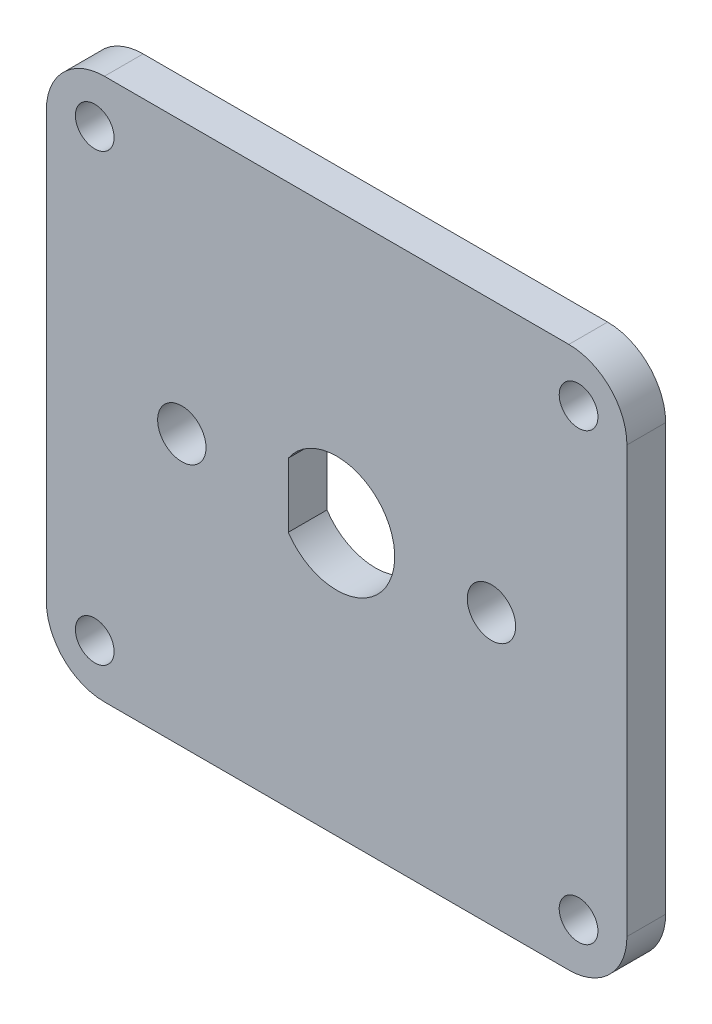
ISO-10303-21;
HEADER;
FILE_DESCRIPTION(('STEP AP214'),'2;1');
FILE_NAME('part.step','',(''),(''),'','','');
FILE_SCHEMA(('AUTOMOTIVE_DESIGN { 1 0 10303 214 1 1 1 1 }'));
ENDSEC;
DATA;
#1=APPLICATION_CONTEXT('core data for automotive mechanical design processes');
#2=APPLICATION_PROTOCOL_DEFINITION('international standard','automotive_design',2000,#1);
#3=PRODUCT_CONTEXT('',#1,'mechanical');
#4=PRODUCT('Part','Part','',(#3));
#5=PRODUCT_RELATED_PRODUCT_CATEGORY('part','',(#4));
#6=PRODUCT_DEFINITION_FORMATION('','',#4);
#7=PRODUCT_DEFINITION_CONTEXT('part definition',#1,'design');
#8=PRODUCT_DEFINITION('design','',#6,#7);
#9=PRODUCT_DEFINITION_SHAPE('','',#8);
#10=(LENGTH_UNIT() NAMED_UNIT(*) SI_UNIT(.MILLI.,.METRE.));
#11=(NAMED_UNIT(*) PLANE_ANGLE_UNIT() SI_UNIT($,.RADIAN.));
#12=(NAMED_UNIT(*) SI_UNIT($,.STERADIAN.) SOLID_ANGLE_UNIT());
#13=UNCERTAINTY_MEASURE_WITH_UNIT(LENGTH_MEASURE(1.E-05),#10,'distance_accuracy_value','');
#14=(GEOMETRIC_REPRESENTATION_CONTEXT(3) GLOBAL_UNCERTAINTY_ASSIGNED_CONTEXT((#13)) GLOBAL_UNIT_ASSIGNED_CONTEXT((#10,
#11,#12)) REPRESENTATION_CONTEXT('',''));
#15=CARTESIAN_POINT('',(0.,0.,0.));
#16=DIRECTION('',(0.,0.,1.));
#17=DIRECTION('',(1.,0.,0.));
#18=AXIS2_PLACEMENT_3D('',#15,#16,#17);
#19=CARTESIAN_POINT('',(-15.,-14.,2.));
#20=DIRECTION('',(0.,1.,0.));
#21=DIRECTION('',(0.,0.,1.));
#22=AXIS2_PLACEMENT_3D('',#19,#20,#21);
#23=PLANE('',#22);
#24=DIRECTION('',(1.,0.,0.));
#25=VECTOR('',#24,1.);
#26=CARTESIAN_POINT('',(-15.,-14.,2.));
#27=LINE('',#26,#25);
#28=CARTESIAN_POINT('',(-12.,-14.,2.));
#29=VERTEX_POINT('',#28);
#30=CARTESIAN_POINT('',(12.,-14.,2.));
#31=VERTEX_POINT('',#30);
#32=EDGE_CURVE('E151',#29,#31,#27,.T.);
#33=ORIENTED_EDGE('',*,*,#32,.F.);
#34=DIRECTION('',(0.,0.,-1.));
#35=VECTOR('',#34,1.);
#36=CARTESIAN_POINT('',(-12.,-14.,0.));
#37=LINE('',#36,#35);
#38=CARTESIAN_POINT('',(-12.,-14.,0.));
#39=VERTEX_POINT('',#38);
#40=EDGE_CURVE('E177',#29,#39,#37,.T.);
#41=ORIENTED_EDGE('',*,*,#40,.T.);
#42=DIRECTION('',(1.,0.,0.));
#43=VECTOR('',#42,1.);
#44=CARTESIAN_POINT('',(-15.,-14.,0.));
#45=LINE('',#44,#43);
#46=CARTESIAN_POINT('',(12.,-14.,0.));
#47=VERTEX_POINT('',#46);
#48=EDGE_CURVE('E165',#39,#47,#45,.T.);
#49=ORIENTED_EDGE('',*,*,#48,.T.);
#50=DIRECTION('',(0.,0.,-1.));
#51=VECTOR('',#50,1.);
#52=CARTESIAN_POINT('',(12.,-14.,2.));
#53=LINE('',#52,#51);
#54=EDGE_CURVE('E164',#47,#31,#53,.F.);
#55=ORIENTED_EDGE('',*,*,#54,.T.);
#56=EDGE_LOOP('',(#33,#41,#49,#55));
#57=FACE_BOUND('',#56,.T.);
#58=ADVANCED_FACE('F36',(#57),#23,.F.);
#59=CARTESIAN_POINT('',(15.,-14.,2.));
#60=DIRECTION('',(-1.,0.,0.));
#61=DIRECTION('',(0.,0.,1.));
#62=AXIS2_PLACEMENT_3D('',#59,#60,#61);
#63=PLANE('',#62);
#64=DIRECTION('',(0.,1.,0.));
#65=VECTOR('',#64,1.);
#66=CARTESIAN_POINT('',(15.,-14.,2.));
#67=LINE('',#66,#65);
#68=CARTESIAN_POINT('',(15.,-11.,2.));
#69=VERTEX_POINT('',#68);
#70=CARTESIAN_POINT('',(15.,11.,2.));
#71=VERTEX_POINT('',#70);
#72=EDGE_CURVE('E154',#69,#71,#67,.T.);
#73=ORIENTED_EDGE('',*,*,#72,.F.);
#74=DIRECTION('',(0.,0.,-1.));
#75=VECTOR('',#74,1.);
#76=CARTESIAN_POINT('',(15.,-11.,2.));
#77=LINE('',#76,#75);
#78=CARTESIAN_POINT('',(15.,-11.,0.));
#79=VERTEX_POINT('',#78);
#80=EDGE_CURVE('E11',#69,#79,#77,.T.);
#81=ORIENTED_EDGE('',*,*,#80,.T.);
#82=DIRECTION('',(0.,1.,0.));
#83=VECTOR('',#82,1.);
#84=CARTESIAN_POINT('',(15.,-14.,0.));
#85=LINE('',#84,#83);
#86=CARTESIAN_POINT('',(15.,11.,0.));
#87=VERTEX_POINT('',#86);
#88=EDGE_CURVE('E168',#79,#87,#85,.T.);
#89=ORIENTED_EDGE('',*,*,#88,.T.);
#90=DIRECTION('',(0.,0.,-1.));
#91=VECTOR('',#90,1.);
#92=CARTESIAN_POINT('',(15.,11.,2.));
#93=LINE('',#92,#91);
#94=EDGE_CURVE('E45',#87,#71,#93,.F.);
#95=ORIENTED_EDGE('',*,*,#94,.T.);
#96=EDGE_LOOP('',(#73,#81,#89,#95));
#97=FACE_BOUND('',#96,.T.);
#98=ADVANCED_FACE('F240',(#97),#63,.F.);
#99=CARTESIAN_POINT('',(-15.,14.,2.));
#100=DIRECTION('',(0.,1.,0.));
#101=DIRECTION('',(0.,0.,1.));
#102=AXIS2_PLACEMENT_3D('',#99,#100,#101);
#103=PLANE('',#102);
#104=DIRECTION('',(1.,0.,0.));
#105=VECTOR('',#104,1.);
#106=CARTESIAN_POINT('',(-15.,14.,0.));
#107=LINE('',#106,#105);
#108=CARTESIAN_POINT('',(-12.,14.,0.));
#109=VERTEX_POINT('',#108);
#110=CARTESIAN_POINT('',(12.,14.,0.));
#111=VERTEX_POINT('',#110);
#112=EDGE_CURVE('E171',#109,#111,#107,.T.);
#113=ORIENTED_EDGE('',*,*,#112,.F.);
#114=DIRECTION('',(0.,0.,-1.));
#115=VECTOR('',#114,1.);
#116=CARTESIAN_POINT('',(-12.,14.,2.));
#117=LINE('',#116,#115);
#118=CARTESIAN_POINT('',(-12.,14.,2.));
#119=VERTEX_POINT('',#118);
#120=EDGE_CURVE('E204',#109,#119,#117,.F.);
#121=ORIENTED_EDGE('',*,*,#120,.T.);
#122=DIRECTION('',(1.,0.,0.));
#123=VECTOR('',#122,1.);
#124=CARTESIAN_POINT('',(-15.,14.,2.));
#125=LINE('',#124,#123);
#126=CARTESIAN_POINT('',(12.,14.,2.));
#127=VERTEX_POINT('',#126);
#128=EDGE_CURVE('E158',#119,#127,#125,.T.);
#129=ORIENTED_EDGE('',*,*,#128,.T.);
#130=DIRECTION('',(0.,0.,-1.));
#131=VECTOR('',#130,1.);
#132=CARTESIAN_POINT('',(12.,14.,0.));
#133=LINE('',#132,#131);
#134=EDGE_CURVE('E201',#127,#111,#133,.T.);
#135=ORIENTED_EDGE('',*,*,#134,.T.);
#136=EDGE_LOOP('',(#113,#121,#129,#135));
#137=FACE_BOUND('',#136,.T.);
#138=ADVANCED_FACE('F246',(#137),#103,.T.);
#139=CARTESIAN_POINT('',(-15.,-14.,2.));
#140=DIRECTION('',(-1.,0.,0.));
#141=DIRECTION('',(0.,0.,1.));
#142=AXIS2_PLACEMENT_3D('',#139,#140,#141);
#143=PLANE('',#142);
#144=DIRECTION('',(0.,1.,0.));
#145=VECTOR('',#144,1.);
#146=CARTESIAN_POINT('',(-15.,-14.,0.));
#147=LINE('',#146,#145);
#148=CARTESIAN_POINT('',(-15.,-11.,0.));
#149=VERTEX_POINT('',#148);
#150=CARTESIAN_POINT('',(-15.,11.,0.));
#151=VERTEX_POINT('',#150);
#152=EDGE_CURVE('E155',#149,#151,#147,.T.);
#153=ORIENTED_EDGE('',*,*,#152,.F.);
#154=DIRECTION('',(0.,0.,-1.));
#155=VECTOR('',#154,1.);
#156=CARTESIAN_POINT('',(-15.,-11.,2.));
#157=LINE('',#156,#155);
#158=CARTESIAN_POINT('',(-15.,-11.,2.));
#159=VERTEX_POINT('',#158);
#160=EDGE_CURVE('E191',#149,#159,#157,.F.);
#161=ORIENTED_EDGE('',*,*,#160,.T.);
#162=DIRECTION('',(0.,1.,0.));
#163=VECTOR('',#162,1.);
#164=CARTESIAN_POINT('',(-15.,-14.,2.));
#165=LINE('',#164,#163);
#166=CARTESIAN_POINT('',(-15.,11.,2.));
#167=VERTEX_POINT('',#166);
#168=EDGE_CURVE('E161',#159,#167,#165,.T.);
#169=ORIENTED_EDGE('',*,*,#168,.T.);
#170=DIRECTION('',(0.,0.,-1.));
#171=VECTOR('',#170,1.);
#172=CARTESIAN_POINT('',(-15.,11.,2.));
#173=LINE('',#172,#171);
#174=EDGE_CURVE('E188',#167,#151,#173,.T.);
#175=ORIENTED_EDGE('',*,*,#174,.T.);
#176=EDGE_LOOP('',(#153,#161,#169,#175));
#177=FACE_BOUND('',#176,.T.);
#178=ADVANCED_FACE('F286',(#177),#143,.T.);
#179=CARTESIAN_POINT('',(0.,0.,2.));
#180=DIRECTION('',(0.,0.,1.));
#181=DIRECTION('',(1.,0.,0.));
#182=AXIS2_PLACEMENT_3D('',#179,#180,#181);
#183=PLANE('',#182);
#184=CARTESIAN_POINT('',(0.,0.,2.));
#185=DIRECTION('',(0.,0.,1.));
#186=DIRECTION('',(1.,0.,0.));
#187=AXIS2_PLACEMENT_3D('',#184,#185,#186);
#188=CIRCLE('',#187,3.);
#189=CARTESIAN_POINT('',(-2.5,-1.6583123951777,2.));
#190=VERTEX_POINT('',#189);
#191=CARTESIAN_POINT('',(-2.5,1.6583123951777,2.));
#192=VERTEX_POINT('',#191);
#193=EDGE_CURVE('E112',#190,#192,#188,.T.);
#194=ORIENTED_EDGE('',*,*,#193,.F.);
#195=DIRECTION('',(0.,1.,0.));
#196=VECTOR('',#195,1.);
#197=CARTESIAN_POINT('',(-2.5,1.6583123951777,2.));
#198=LINE('',#197,#196);
#199=EDGE_CURVE('E116',#190,#192,#198,.T.);
#200=ORIENTED_EDGE('',*,*,#199,.T.);
#201=EDGE_LOOP('',(#194,#200));
#202=FACE_BOUND('',#201,.T.);
#203=CARTESIAN_POINT('',(-7.99999999999999,0.,2.));
#204=DIRECTION('',(0.,0.,1.));
#205=DIRECTION('',(-1.,0.,0.));
#206=AXIS2_PLACEMENT_3D('',#203,#204,#205);
#207=CIRCLE('',#206,1.25);
#208=CARTESIAN_POINT('',(-9.25,0.,2.));
#209=VERTEX_POINT('',#208);
#210=EDGE_CURVE('E137',#209,#209,#207,.T.);
#211=ORIENTED_EDGE('',*,*,#210,.F.);
#212=EDGE_LOOP('',(#211));
#213=FACE_BOUND('',#212,.T.);
#214=CARTESIAN_POINT('',(8.00000000000001,0.,2.));
#215=DIRECTION('',(0.,0.,1.));
#216=DIRECTION('',(1.,0.,0.));
#217=AXIS2_PLACEMENT_3D('',#214,#215,#216);
#218=CIRCLE('',#217,1.25);
#219=CARTESIAN_POINT('',(9.25,0.,2.));
#220=VERTEX_POINT('',#219);
#221=EDGE_CURVE('E134',#220,#220,#218,.T.);
#222=ORIENTED_EDGE('',*,*,#221,.F.);
#223=EDGE_LOOP('',(#222));
#224=FACE_BOUND('',#223,.T.);
#225=CARTESIAN_POINT('',(12.5,-11.5,2.));
#226=DIRECTION('',(0.,0.,1.));
#227=DIRECTION('',(1.,0.,0.));
#228=AXIS2_PLACEMENT_3D('',#225,#226,#227);
#229=CIRCLE('',#228,1.);
#230=CARTESIAN_POINT('',(13.5,-11.5,2.));
#231=VERTEX_POINT('',#230);
#232=EDGE_CURVE('E130',#231,#231,#229,.T.);
#233=ORIENTED_EDGE('',*,*,#232,.F.);
#234=EDGE_LOOP('',(#233));
#235=FACE_BOUND('',#234,.T.);
#236=CARTESIAN_POINT('',(-12.5,-11.5,2.));
#237=DIRECTION('',(0.,0.,1.));
#238=DIRECTION('',(-1.,0.,0.));
#239=AXIS2_PLACEMENT_3D('',#236,#237,#238);
#240=CIRCLE('',#239,1.);
#241=CARTESIAN_POINT('',(-13.5,-11.5,2.));
#242=VERTEX_POINT('',#241);
#243=EDGE_CURVE('E133',#242,#242,#240,.T.);
#244=ORIENTED_EDGE('',*,*,#243,.F.);
#245=EDGE_LOOP('',(#244));
#246=FACE_BOUND('',#245,.T.);
#247=CARTESIAN_POINT('',(12.5,11.5,2.));
#248=DIRECTION('',(0.,0.,1.));
#249=DIRECTION('',(-1.,0.,0.));
#250=AXIS2_PLACEMENT_3D('',#247,#248,#249);
#251=CIRCLE('',#250,1.);
#252=CARTESIAN_POINT('',(11.5,11.5,2.));
#253=VERTEX_POINT('',#252);
#254=EDGE_CURVE('E140',#253,#253,#251,.T.);
#255=ORIENTED_EDGE('',*,*,#254,.F.);
#256=EDGE_LOOP('',(#255));
#257=FACE_BOUND('',#256,.T.);
#258=CARTESIAN_POINT('',(-12.5,11.5,2.));
#259=DIRECTION('',(0.,0.,1.));
#260=DIRECTION('',(1.,0.,0.));
#261=AXIS2_PLACEMENT_3D('',#258,#259,#260);
#262=CIRCLE('',#261,1.);
#263=CARTESIAN_POINT('',(-11.5,11.5,2.));
#264=VERTEX_POINT('',#263);
#265=EDGE_CURVE('E146',#264,#264,#262,.T.);
#266=ORIENTED_EDGE('',*,*,#265,.F.);
#267=EDGE_LOOP('',(#266));
#268=FACE_BOUND('',#267,.T.);
#269=ORIENTED_EDGE('',*,*,#168,.F.);
#270=CARTESIAN_POINT('',(-12.,-11.,2.));
#271=DIRECTION('',(0.,0.,1.));
#272=DIRECTION('',(1.,0.,0.));
#273=AXIS2_PLACEMENT_3D('',#270,#271,#272);
#274=CIRCLE('',#273,3.);
#275=EDGE_CURVE('E199',#159,#29,#274,.T.);
#276=ORIENTED_EDGE('',*,*,#275,.T.);
#277=ORIENTED_EDGE('',*,*,#32,.T.);
#278=CARTESIAN_POINT('',(12.,-11.,2.));
#279=DIRECTION('',(0.,0.,1.));
#280=DIRECTION('',(1.,0.,0.));
#281=AXIS2_PLACEMENT_3D('',#278,#279,#280);
#282=CIRCLE('',#281,3.);
#283=EDGE_CURVE('E195',#31,#69,#282,.T.);
#284=ORIENTED_EDGE('',*,*,#283,.T.);
#285=ORIENTED_EDGE('',*,*,#72,.T.);
#286=CARTESIAN_POINT('',(12.,11.,2.));
#287=DIRECTION('',(0.,0.,1.));
#288=DIRECTION('',(1.,0.,0.));
#289=AXIS2_PLACEMENT_3D('',#286,#287,#288);
#290=CIRCLE('',#289,3.);
#291=EDGE_CURVE('E193',#71,#127,#290,.T.);
#292=ORIENTED_EDGE('',*,*,#291,.T.);
#293=ORIENTED_EDGE('',*,*,#128,.F.);
#294=CARTESIAN_POINT('',(-12.,11.,2.));
#295=DIRECTION('',(0.,0.,1.));
#296=DIRECTION('',(1.,0.,0.));
#297=AXIS2_PLACEMENT_3D('',#294,#295,#296);
#298=CIRCLE('',#297,3.);
#299=EDGE_CURVE('E197',#119,#167,#298,.T.);
#300=ORIENTED_EDGE('',*,*,#299,.T.);
#301=EDGE_LOOP('',(#269,#276,#277,#284,#285,#292,#293,#300));
#302=FACE_BOUND('',#301,.T.);
#303=ADVANCED_FACE('F113',(#202,#213,#224,#235,#246,#257,#268,#302),#183,.T.);
#304=CARTESIAN_POINT('',(0.,0.,0.));
#305=DIRECTION('',(0.,0.,1.));
#306=DIRECTION('',(1.,0.,0.));
#307=AXIS2_PLACEMENT_3D('',#304,#305,#306);
#308=PLANE('',#307);
#309=CARTESIAN_POINT('',(0.,0.,0.));
#310=DIRECTION('',(0.,0.,1.));
#311=DIRECTION('',(1.,0.,0.));
#312=AXIS2_PLACEMENT_3D('',#309,#310,#311);
#313=CIRCLE('',#312,3.);
#314=CARTESIAN_POINT('',(-2.5,-1.6583123951777,0.));
#315=VERTEX_POINT('',#314);
#316=CARTESIAN_POINT('',(-2.5,1.6583123951777,0.));
#317=VERTEX_POINT('',#316);
#318=EDGE_CURVE('E40',#315,#317,#313,.T.);
#319=ORIENTED_EDGE('',*,*,#318,.T.);
#320=DIRECTION('',(0.,1.,0.));
#321=VECTOR('',#320,1.);
#322=CARTESIAN_POINT('',(-2.5,1.6583123951777,0.));
#323=LINE('',#322,#321);
#324=EDGE_CURVE('E123',#315,#317,#323,.T.);
#325=ORIENTED_EDGE('',*,*,#324,.F.);
#326=EDGE_LOOP('',(#319,#325));
#327=FACE_BOUND('',#326,.T.);
#328=CARTESIAN_POINT('',(-7.99999999999999,0.,0.));
#329=DIRECTION('',(0.,0.,1.));
#330=DIRECTION('',(1.,0.,0.));
#331=AXIS2_PLACEMENT_3D('',#328,#329,#330);
#332=CIRCLE('',#331,1.25);
#333=CARTESIAN_POINT('',(-6.74999999999999,0.,0.));
#334=VERTEX_POINT('',#333);
#335=EDGE_CURVE('E150',#334,#334,#332,.T.);
#336=ORIENTED_EDGE('',*,*,#335,.T.);
#337=EDGE_LOOP('',(#336));
#338=FACE_BOUND('',#337,.T.);
#339=CARTESIAN_POINT('',(8.00000000000001,0.,0.));
#340=DIRECTION('',(0.,0.,1.));
#341=DIRECTION('',(1.,0.,0.));
#342=AXIS2_PLACEMENT_3D('',#339,#340,#341);
#343=CIRCLE('',#342,1.25);
#344=CARTESIAN_POINT('',(9.25,0.,0.));
#345=VERTEX_POINT('',#344);
#346=EDGE_CURVE('E217',#345,#345,#343,.T.);
#347=ORIENTED_EDGE('',*,*,#346,.T.);
#348=EDGE_LOOP('',(#347));
#349=FACE_BOUND('',#348,.T.);
#350=CARTESIAN_POINT('',(12.5,-11.5,0.));
#351=DIRECTION('',(0.,0.,1.));
#352=DIRECTION('',(1.,0.,0.));
#353=AXIS2_PLACEMENT_3D('',#350,#351,#352);
#354=CIRCLE('',#353,1.);
#355=CARTESIAN_POINT('',(13.5,-11.5,0.));
#356=VERTEX_POINT('',#355);
#357=EDGE_CURVE('E214',#356,#356,#354,.T.);
#358=ORIENTED_EDGE('',*,*,#357,.T.);
#359=EDGE_LOOP('',(#358));
#360=FACE_BOUND('',#359,.T.);
#361=CARTESIAN_POINT('',(-12.5,-11.5,0.));
#362=DIRECTION('',(0.,0.,1.));
#363=DIRECTION('',(1.,0.,0.));
#364=AXIS2_PLACEMENT_3D('',#361,#362,#363);
#365=CIRCLE('',#364,1.);
#366=CARTESIAN_POINT('',(-11.5,-11.5,0.));
#367=VERTEX_POINT('',#366);
#368=EDGE_CURVE('E211',#367,#367,#365,.T.);
#369=ORIENTED_EDGE('',*,*,#368,.T.);
#370=EDGE_LOOP('',(#369));
#371=FACE_BOUND('',#370,.T.);
#372=CARTESIAN_POINT('',(12.5,11.5,0.));
#373=DIRECTION('',(0.,0.,1.));
#374=DIRECTION('',(1.,0.,0.));
#375=AXIS2_PLACEMENT_3D('',#372,#373,#374);
#376=CIRCLE('',#375,1.);
#377=CARTESIAN_POINT('',(13.5,11.5,0.));
#378=VERTEX_POINT('',#377);
#379=EDGE_CURVE('E143',#378,#378,#376,.T.);
#380=ORIENTED_EDGE('',*,*,#379,.T.);
#381=EDGE_LOOP('',(#380));
#382=FACE_BOUND('',#381,.T.);
#383=CARTESIAN_POINT('',(-12.5,11.5,0.));
#384=DIRECTION('',(0.,0.,1.));
#385=DIRECTION('',(1.,0.,0.));
#386=AXIS2_PLACEMENT_3D('',#383,#384,#385);
#387=CIRCLE('',#386,1.);
#388=CARTESIAN_POINT('',(-11.5,11.5,0.));
#389=VERTEX_POINT('',#388);
#390=EDGE_CURVE('E149',#389,#389,#387,.T.);
#391=ORIENTED_EDGE('',*,*,#390,.T.);
#392=EDGE_LOOP('',(#391));
#393=FACE_BOUND('',#392,.T.);
#394=ORIENTED_EDGE('',*,*,#48,.F.);
#395=CARTESIAN_POINT('',(-12.,-11.,0.));
#396=DIRECTION('',(0.,0.,1.));
#397=DIRECTION('',(1.,0.,0.));
#398=AXIS2_PLACEMENT_3D('',#395,#396,#397);
#399=CIRCLE('',#398,3.);
#400=EDGE_CURVE('E186',#39,#149,#399,.F.);
#401=ORIENTED_EDGE('',*,*,#400,.T.);
#402=ORIENTED_EDGE('',*,*,#152,.T.);
#403=CARTESIAN_POINT('',(-12.,11.,0.));
#404=DIRECTION('',(0.,0.,1.));
#405=DIRECTION('',(1.,0.,0.));
#406=AXIS2_PLACEMENT_3D('',#403,#404,#405);
#407=CIRCLE('',#406,3.);
#408=EDGE_CURVE('E184',#151,#109,#407,.F.);
#409=ORIENTED_EDGE('',*,*,#408,.T.);
#410=ORIENTED_EDGE('',*,*,#112,.T.);
#411=CARTESIAN_POINT('',(12.,11.,0.));
#412=DIRECTION('',(0.,0.,1.));
#413=DIRECTION('',(1.,0.,0.));
#414=AXIS2_PLACEMENT_3D('',#411,#412,#413);
#415=CIRCLE('',#414,3.);
#416=EDGE_CURVE('E180',#111,#87,#415,.F.);
#417=ORIENTED_EDGE('',*,*,#416,.T.);
#418=ORIENTED_EDGE('',*,*,#88,.F.);
#419=CARTESIAN_POINT('',(12.,-11.,0.));
#420=DIRECTION('',(0.,0.,1.));
#421=DIRECTION('',(1.,0.,0.));
#422=AXIS2_PLACEMENT_3D('',#419,#420,#421);
#423=CIRCLE('',#422,3.);
#424=EDGE_CURVE('E182',#79,#47,#423,.F.);
#425=ORIENTED_EDGE('',*,*,#424,.T.);
#426=EDGE_LOOP('',(#394,#401,#402,#409,#410,#417,#418,#425));
#427=FACE_BOUND('',#426,.T.);
#428=ADVANCED_FACE('F222',(#327,#338,#349,#360,#371,#382,#393,#427),#308,.F.);
#429=CARTESIAN_POINT('',(-12.,-11.,2.));
#430=DIRECTION('',(0.,0.,1.));
#431=DIRECTION('',(1.,0.,0.));
#432=AXIS2_PLACEMENT_3D('',#429,#430,#431);
#433=CYLINDRICAL_SURFACE('',#432,3.);
#434=ORIENTED_EDGE('',*,*,#275,.F.);
#435=ORIENTED_EDGE('',*,*,#160,.F.);
#436=ORIENTED_EDGE('',*,*,#400,.F.);
#437=ORIENTED_EDGE('',*,*,#40,.F.);
#438=EDGE_LOOP('',(#434,#435,#436,#437));
#439=FACE_BOUND('',#438,.T.);
#440=ADVANCED_FACE('F252',(#439),#433,.T.);
#441=CARTESIAN_POINT('',(-12.,11.,2.));
#442=DIRECTION('',(0.,0.,-1.));
#443=DIRECTION('',(-1.,0.,0.));
#444=AXIS2_PLACEMENT_3D('',#441,#442,#443);
#445=CYLINDRICAL_SURFACE('',#444,3.);
#446=ORIENTED_EDGE('',*,*,#299,.F.);
#447=ORIENTED_EDGE('',*,*,#120,.F.);
#448=ORIENTED_EDGE('',*,*,#408,.F.);
#449=ORIENTED_EDGE('',*,*,#174,.F.);
#450=EDGE_LOOP('',(#446,#447,#448,#449));
#451=FACE_BOUND('',#450,.T.);
#452=ADVANCED_FACE('F255',(#451),#445,.T.);
#453=CARTESIAN_POINT('',(12.,-11.,2.));
#454=DIRECTION('',(0.,0.,-1.));
#455=DIRECTION('',(-1.,0.,0.));
#456=AXIS2_PLACEMENT_3D('',#453,#454,#455);
#457=CYLINDRICAL_SURFACE('',#456,3.);
#458=ORIENTED_EDGE('',*,*,#283,.F.);
#459=ORIENTED_EDGE('',*,*,#54,.F.);
#460=ORIENTED_EDGE('',*,*,#424,.F.);
#461=ORIENTED_EDGE('',*,*,#80,.F.);
#462=EDGE_LOOP('',(#458,#459,#460,#461));
#463=FACE_BOUND('',#462,.T.);
#464=ADVANCED_FACE('F258',(#463),#457,.T.);
#465=CARTESIAN_POINT('',(12.,11.,2.));
#466=DIRECTION('',(0.,0.,1.));
#467=DIRECTION('',(1.,0.,0.));
#468=AXIS2_PLACEMENT_3D('',#465,#466,#467);
#469=CYLINDRICAL_SURFACE('',#468,3.);
#470=ORIENTED_EDGE('',*,*,#291,.F.);
#471=ORIENTED_EDGE('',*,*,#94,.F.);
#472=ORIENTED_EDGE('',*,*,#416,.F.);
#473=ORIENTED_EDGE('',*,*,#134,.F.);
#474=EDGE_LOOP('',(#470,#471,#472,#473));
#475=FACE_BOUND('',#474,.T.);
#476=ADVANCED_FACE('F38',(#475),#469,.T.);
#477=CARTESIAN_POINT('',(-12.5,11.5,-8.));
#478=DIRECTION('',(0.,0.,1.));
#479=DIRECTION('',(1.,0.,0.));
#480=AXIS2_PLACEMENT_3D('',#477,#478,#479);
#481=CYLINDRICAL_SURFACE('',#480,1.);
#482=ORIENTED_EDGE('',*,*,#265,.T.);
#483=EDGE_LOOP('',(#482));
#484=FACE_BOUND('',#483,.T.);
#485=ORIENTED_EDGE('',*,*,#390,.F.);
#486=EDGE_LOOP('',(#485));
#487=FACE_BOUND('',#486,.T.);
#488=ADVANCED_FACE('F265',(#484,#487),#481,.F.);
#489=CARTESIAN_POINT('',(12.5,11.5,-8.));
#490=DIRECTION('',(0.,0.,1.));
#491=DIRECTION('',(1.,0.,0.));
#492=AXIS2_PLACEMENT_3D('',#489,#490,#491);
#493=CYLINDRICAL_SURFACE('',#492,1.);
#494=ORIENTED_EDGE('',*,*,#254,.T.);
#495=EDGE_LOOP('',(#494));
#496=FACE_BOUND('',#495,.T.);
#497=ORIENTED_EDGE('',*,*,#379,.F.);
#498=EDGE_LOOP('',(#497));
#499=FACE_BOUND('',#498,.T.);
#500=ADVANCED_FACE('F349',(#496,#499),#493,.F.);
#501=CARTESIAN_POINT('',(-12.5,-11.5,-8.));
#502=DIRECTION('',(0.,0.,1.));
#503=DIRECTION('',(1.,0.,0.));
#504=AXIS2_PLACEMENT_3D('',#501,#502,#503);
#505=CYLINDRICAL_SURFACE('',#504,1.);
#506=ORIENTED_EDGE('',*,*,#243,.T.);
#507=EDGE_LOOP('',(#506));
#508=FACE_BOUND('',#507,.T.);
#509=ORIENTED_EDGE('',*,*,#368,.F.);
#510=EDGE_LOOP('',(#509));
#511=FACE_BOUND('',#510,.T.);
#512=ADVANCED_FACE('F344',(#508,#511),#505,.F.);
#513=CARTESIAN_POINT('',(12.5,-11.5,-8.));
#514=DIRECTION('',(0.,0.,1.));
#515=DIRECTION('',(1.,0.,0.));
#516=AXIS2_PLACEMENT_3D('',#513,#514,#515);
#517=CYLINDRICAL_SURFACE('',#516,1.);
#518=ORIENTED_EDGE('',*,*,#232,.T.);
#519=EDGE_LOOP('',(#518));
#520=FACE_BOUND('',#519,.T.);
#521=ORIENTED_EDGE('',*,*,#357,.F.);
#522=EDGE_LOOP('',(#521));
#523=FACE_BOUND('',#522,.T.);
#524=ADVANCED_FACE('F235',(#520,#523),#517,.F.);
#525=CARTESIAN_POINT('',(8.00000000000001,0.,-8.));
#526=DIRECTION('',(0.,0.,1.));
#527=DIRECTION('',(1.,0.,0.));
#528=AXIS2_PLACEMENT_3D('',#525,#526,#527);
#529=CYLINDRICAL_SURFACE('',#528,1.25);
#530=ORIENTED_EDGE('',*,*,#221,.T.);
#531=EDGE_LOOP('',(#530));
#532=FACE_BOUND('',#531,.T.);
#533=ORIENTED_EDGE('',*,*,#346,.F.);
#534=EDGE_LOOP('',(#533));
#535=FACE_BOUND('',#534,.T.);
#536=ADVANCED_FACE('F227',(#532,#535),#529,.F.);
#537=CARTESIAN_POINT('',(-7.99999999999999,0.,-8.));
#538=DIRECTION('',(0.,0.,1.));
#539=DIRECTION('',(1.,0.,0.));
#540=AXIS2_PLACEMENT_3D('',#537,#538,#539);
#541=CYLINDRICAL_SURFACE('',#540,1.25);
#542=ORIENTED_EDGE('',*,*,#210,.T.);
#543=EDGE_LOOP('',(#542));
#544=FACE_BOUND('',#543,.T.);
#545=ORIENTED_EDGE('',*,*,#335,.F.);
#546=EDGE_LOOP('',(#545));
#547=FACE_BOUND('',#546,.T.);
#548=ADVANCED_FACE('F225',(#544,#547),#541,.F.);
#549=CARTESIAN_POINT('',(0.,0.,-8.));
#550=DIRECTION('',(0.,0.,1.));
#551=DIRECTION('',(1.,0.,0.));
#552=AXIS2_PLACEMENT_3D('',#549,#550,#551);
#553=CYLINDRICAL_SURFACE('',#552,3.);
#554=ORIENTED_EDGE('',*,*,#193,.T.);
#555=DIRECTION('',(0.,0.,1.));
#556=VECTOR('',#555,1.);
#557=CARTESIAN_POINT('',(-2.5,1.6583123951777,0.));
#558=LINE('',#557,#556);
#559=EDGE_CURVE('E57',#317,#192,#558,.T.);
#560=ORIENTED_EDGE('',*,*,#559,.F.);
#561=ORIENTED_EDGE('',*,*,#318,.F.);
#562=DIRECTION('',(0.,0.,1.));
#563=VECTOR('',#562,1.);
#564=CARTESIAN_POINT('',(-2.5,-1.6583123951777,0.));
#565=LINE('',#564,#563);
#566=EDGE_CURVE('E118',#315,#190,#565,.T.);
#567=ORIENTED_EDGE('',*,*,#566,.T.);
#568=EDGE_LOOP('',(#554,#560,#561,#567));
#569=FACE_BOUND('',#568,.T.);
#570=ADVANCED_FACE('F119',(#569),#553,.F.);
#571=CARTESIAN_POINT('',(-2.5,1.6583123951777,0.));
#572=DIRECTION('',(1.,0.,0.));
#573=DIRECTION('',(0.,0.,-1.));
#574=AXIS2_PLACEMENT_3D('',#571,#572,#573);
#575=PLANE('',#574);
#576=ORIENTED_EDGE('',*,*,#199,.F.);
#577=ORIENTED_EDGE('',*,*,#566,.F.);
#578=ORIENTED_EDGE('',*,*,#324,.T.);
#579=ORIENTED_EDGE('',*,*,#559,.T.);
#580=EDGE_LOOP('',(#576,#577,#578,#579));
#581=FACE_BOUND('',#580,.T.);
#582=ADVANCED_FACE('F125',(#581),#575,.T.);
#583=CLOSED_SHELL('',(#58,#98,#138,#178,#303,#428,#440,#452,#464,#476,#488,#500,#512,#524,#536,
#548,#570,#582));
#584=MANIFOLD_SOLID_BREP('B2',#583);
#585=ADVANCED_BREP_SHAPE_REPRESENTATION('',(#18,#584),#14);
#586=SHAPE_DEFINITION_REPRESENTATION(#9,#585);
ENDSEC;
END-ISO-10303-21;
